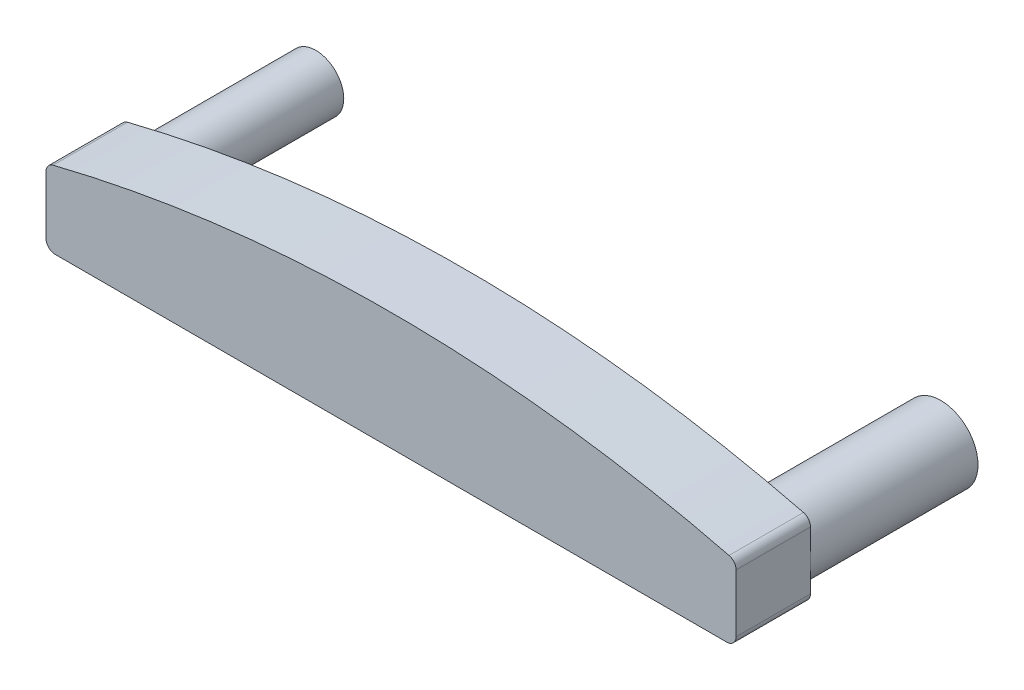
ISO-10303-21;
HEADER;
FILE_DESCRIPTION(('STEP AP214'),'2;1');
FILE_NAME('part.step','',(''),(''),'','','');
FILE_SCHEMA(('AUTOMOTIVE_DESIGN { 1 0 10303 214 1 1 1 1 }'));
ENDSEC;
DATA;
#1=APPLICATION_CONTEXT('core data for automotive mechanical design processes');
#2=APPLICATION_PROTOCOL_DEFINITION('international standard','automotive_design',2000,#1);
#3=PRODUCT_CONTEXT('',#1,'mechanical');
#4=PRODUCT('Part','Part','',(#3));
#5=PRODUCT_RELATED_PRODUCT_CATEGORY('part','',(#4));
#6=PRODUCT_DEFINITION_FORMATION('','',#4);
#7=PRODUCT_DEFINITION_CONTEXT('part definition',#1,'design');
#8=PRODUCT_DEFINITION('design','',#6,#7);
#9=PRODUCT_DEFINITION_SHAPE('','',#8);
#10=(LENGTH_UNIT() NAMED_UNIT(*) SI_UNIT(.MILLI.,.METRE.));
#11=(NAMED_UNIT(*) PLANE_ANGLE_UNIT() SI_UNIT($,.RADIAN.));
#12=(NAMED_UNIT(*) SI_UNIT($,.STERADIAN.) SOLID_ANGLE_UNIT());
#13=UNCERTAINTY_MEASURE_WITH_UNIT(LENGTH_MEASURE(1.E-05),#10,'distance_accuracy_value','');
#14=(GEOMETRIC_REPRESENTATION_CONTEXT(3) GLOBAL_UNCERTAINTY_ASSIGNED_CONTEXT((#13)) GLOBAL_UNIT_ASSIGNED_CONTEXT((#10,
#11,#12)) REPRESENTATION_CONTEXT('',''));
#15=CARTESIAN_POINT('',(0.,0.,0.));
#16=DIRECTION('',(0.,0.,1.));
#17=DIRECTION('',(1.,0.,0.));
#18=AXIS2_PLACEMENT_3D('',#15,#16,#17);
#19=CARTESIAN_POINT('',(18.54,-72.6723358644815,0.));
#20=DIRECTION('',(0.,0.,1.));
#21=DIRECTION('',(1.,0.,0.));
#22=AXIS2_PLACEMENT_3D('',#19,#20,#21);
#23=PLANE('',#22);
#24=DIRECTION('',(1.,0.,0.));
#25=VECTOR('',#24,1.);
#26=CARTESIAN_POINT('',(0.,-4.,0.));
#27=LINE('',#26,#25);
#28=CARTESIAN_POINT('',(0.5,-4.,0.));
#29=VERTEX_POINT('',#28);
#30=CARTESIAN_POINT('',(35.08,-4.,0.));
#31=VERTEX_POINT('',#30);
#32=EDGE_CURVE('E125',#29,#31,#27,.T.);
#33=ORIENTED_EDGE('',*,*,#32,.F.);
#34=CARTESIAN_POINT('',(0.5,-3.5,0.));
#35=DIRECTION('',(0.,0.,1.));
#36=DIRECTION('',(1.,0.,0.));
#37=AXIS2_PLACEMENT_3D('',#34,#35,#36);
#38=CIRCLE('',#37,0.5);
#39=CARTESIAN_POINT('',(0.,-3.5,0.));
#40=VERTEX_POINT('',#39);
#41=EDGE_CURVE('E168',#29,#40,#38,.F.);
#42=ORIENTED_EDGE('',*,*,#41,.T.);
#43=DIRECTION('',(0.,-1.,0.));
#44=VECTOR('',#43,1.);
#45=CARTESIAN_POINT('',(0.,0.,0.));
#46=LINE('',#45,#44);
#47=CARTESIAN_POINT('',(0.,-2.,0.));
#48=VERTEX_POINT('',#47);
#49=EDGE_CURVE('E156',#48,#40,#46,.T.);
#50=ORIENTED_EDGE('',*,*,#49,.F.);
#51=CARTESIAN_POINT('',(1.5,-2.,0.));
#52=DIRECTION('',(0.,0.,1.));
#53=DIRECTION('',(1.,0.,0.));
#54=AXIS2_PLACEMENT_3D('',#51,#52,#53);
#55=CIRCLE('',#54,1.5);
#56=EDGE_CURVE('E151',#48,#48,#55,.T.);
#57=ORIENTED_EDGE('',*,*,#56,.T.);
#58=CARTESIAN_POINT('',(0.,-0.38949972753953,0.));
#59=VERTEX_POINT('',#58);
#60=EDGE_CURVE('E155',#59,#48,#46,.T.);
#61=ORIENTED_EDGE('',*,*,#60,.F.);
#62=CARTESIAN_POINT('',(0.5,-0.38949972753953,0.));
#63=DIRECTION('',(0.,0.,1.));
#64=DIRECTION('',(1.,0.,0.));
#65=AXIS2_PLACEMENT_3D('',#62,#63,#64);
#66=CIRCLE('',#65,0.5);
#67=CARTESIAN_POINT('',(0.378926174496644,0.0956199780775407,0.));
#68=VERTEX_POINT('',#67);
#69=EDGE_CURVE('E164',#59,#68,#66,.F.);
#70=ORIENTED_EDGE('',*,*,#69,.T.);
#71=CARTESIAN_POINT('',(18.54,-72.6723358644815,0.));
#72=DIRECTION('',(0.,0.,1.));
#73=DIRECTION('',(1.,0.,0.));
#74=AXIS2_PLACEMENT_3D('',#71,#72,#73);
#75=CIRCLE('',#74,75.);
#76=CARTESIAN_POINT('',(36.7010738255034,0.0956199780775407,0.));
#77=VERTEX_POINT('',#76);
#78=EDGE_CURVE('E194',#77,#68,#75,.T.);
#79=ORIENTED_EDGE('',*,*,#78,.F.);
#80=CARTESIAN_POINT('',(36.58,-0.38949972753953,0.));
#81=DIRECTION('',(0.,0.,1.));
#82=DIRECTION('',(1.,0.,0.));
#83=AXIS2_PLACEMENT_3D('',#80,#81,#82);
#84=CIRCLE('',#83,0.5);
#85=CARTESIAN_POINT('',(37.08,-0.38949972753953,0.));
#86=VERTEX_POINT('',#85);
#87=EDGE_CURVE('E166',#77,#86,#84,.F.);
#88=ORIENTED_EDGE('',*,*,#87,.T.);
#89=DIRECTION('',(0.,-1.,0.));
#90=VECTOR('',#89,1.);
#91=CARTESIAN_POINT('',(37.08,0.,0.));
#92=LINE('',#91,#90);
#93=CARTESIAN_POINT('',(37.08,-2.,0.));
#94=VERTEX_POINT('',#93);
#95=EDGE_CURVE('E150',#86,#94,#92,.T.);
#96=ORIENTED_EDGE('',*,*,#95,.T.);
#97=CARTESIAN_POINT('',(35.08,-2.,0.));
#98=DIRECTION('',(0.,0.,1.));
#99=DIRECTION('',(1.,0.,0.));
#100=AXIS2_PLACEMENT_3D('',#97,#98,#99);
#101=CIRCLE('',#100,2.);
#102=EDGE_CURVE('E142',#94,#31,#101,.T.);
#103=ORIENTED_EDGE('',*,*,#102,.T.);
#104=EDGE_LOOP('',(#33,#42,#50,#57,#61,#70,#79,#88,#96,#103));
#105=FACE_BOUND('',#104,.T.);
#106=ADVANCED_FACE('F47',(#105),#23,.F.);
#107=CARTESIAN_POINT('',(18.54,-72.6723358644815,4.));
#108=DIRECTION('',(0.,0.,-1.));
#109=DIRECTION('',(-1.,0.,0.));
#110=AXIS2_PLACEMENT_3D('',#107,#108,#109);
#111=CYLINDRICAL_SURFACE('',#110,75.);
#112=CARTESIAN_POINT('',(18.54,-72.6723358644815,4.));
#113=DIRECTION('',(0.,0.,1.));
#114=DIRECTION('',(1.,0.,0.));
#115=AXIS2_PLACEMENT_3D('',#112,#113,#114);
#116=CIRCLE('',#115,75.);
#117=CARTESIAN_POINT('',(36.7010738255034,0.0956199780775407,4.));
#118=VERTEX_POINT('',#117);
#119=CARTESIAN_POINT('',(0.378926174496644,0.0956199780775407,4.));
#120=VERTEX_POINT('',#119);
#121=EDGE_CURVE('E160',#118,#120,#116,.T.);
#122=ORIENTED_EDGE('',*,*,#121,.F.);
#123=DIRECTION('',(0.,0.,-1.));
#124=VECTOR('',#123,1.);
#125=CARTESIAN_POINT('',(36.7010738255034,0.0956199780775407,4.));
#126=LINE('',#125,#124);
#127=EDGE_CURVE('E12',#118,#77,#126,.T.);
#128=ORIENTED_EDGE('',*,*,#127,.T.);
#129=ORIENTED_EDGE('',*,*,#78,.T.);
#130=DIRECTION('',(0.,0.,-1.));
#131=VECTOR('',#130,1.);
#132=CARTESIAN_POINT('',(0.378926174496648,0.0956199780775407,4.));
#133=LINE('',#132,#131);
#134=EDGE_CURVE('E55',#68,#120,#133,.F.);
#135=ORIENTED_EDGE('',*,*,#134,.T.);
#136=EDGE_LOOP('',(#122,#128,#129,#135));
#137=FACE_BOUND('',#136,.T.);
#138=ADVANCED_FACE('F191',(#137),#111,.T.);
#139=CARTESIAN_POINT('',(0.,0.,4.));
#140=DIRECTION('',(1.,0.,0.));
#141=DIRECTION('',(0.,0.,-1.));
#142=AXIS2_PLACEMENT_3D('',#139,#140,#141);
#143=PLANE('',#142);
#144=ORIENTED_EDGE('',*,*,#49,.T.);
#145=DIRECTION('',(0.,0.,-1.));
#146=VECTOR('',#145,1.);
#147=CARTESIAN_POINT('',(0.,-3.5,4.));
#148=LINE('',#147,#146);
#149=CARTESIAN_POINT('',(0.,-3.5,4.));
#150=VERTEX_POINT('',#149);
#151=EDGE_CURVE('E173',#40,#150,#148,.F.);
#152=ORIENTED_EDGE('',*,*,#151,.T.);
#153=DIRECTION('',(0.,-1.,0.));
#154=VECTOR('',#153,1.);
#155=CARTESIAN_POINT('',(0.,0.,4.));
#156=LINE('',#155,#154);
#157=CARTESIAN_POINT('',(0.,-0.38949972753953,4.));
#158=VERTEX_POINT('',#157);
#159=EDGE_CURVE('E201',#158,#150,#156,.T.);
#160=ORIENTED_EDGE('',*,*,#159,.F.);
#161=DIRECTION('',(0.,0.,-1.));
#162=VECTOR('',#161,1.);
#163=CARTESIAN_POINT('',(0.,-0.38949972753953,4.));
#164=LINE('',#163,#162);
#165=EDGE_CURVE('E170',#158,#59,#164,.T.);
#166=ORIENTED_EDGE('',*,*,#165,.T.);
#167=ORIENTED_EDGE('',*,*,#60,.T.);
#168=EDGE_LOOP('',(#144,#152,#160,#166,#167));
#169=FACE_BOUND('',#168,.T.);
#170=ADVANCED_FACE('F207',(#169),#143,.F.);
#171=CARTESIAN_POINT('',(0.,-4.,4.));
#172=DIRECTION('',(0.,1.,0.));
#173=DIRECTION('',(0.,0.,1.));
#174=AXIS2_PLACEMENT_3D('',#171,#172,#173);
#175=PLANE('',#174);
#176=DIRECTION('',(1.,0.,0.));
#177=VECTOR('',#176,1.);
#178=CARTESIAN_POINT('',(0.,-4.,4.));
#179=LINE('',#178,#177);
#180=CARTESIAN_POINT('',(0.5,-4.,4.));
#181=VERTEX_POINT('',#180);
#182=CARTESIAN_POINT('',(36.58,-4.,4.));
#183=VERTEX_POINT('',#182);
#184=EDGE_CURVE('E219',#181,#183,#179,.T.);
#185=ORIENTED_EDGE('',*,*,#184,.F.);
#186=DIRECTION('',(0.,0.,-1.));
#187=VECTOR('',#186,1.);
#188=CARTESIAN_POINT('',(0.5,-4.,4.));
#189=LINE('',#188,#187);
#190=EDGE_CURVE('E132',#181,#29,#189,.T.);
#191=ORIENTED_EDGE('',*,*,#190,.T.);
#192=ORIENTED_EDGE('',*,*,#32,.T.);
#193=CARTESIAN_POINT('',(36.58,-4.,0.));
#194=VERTEX_POINT('',#193);
#195=EDGE_CURVE('E130',#31,#194,#27,.T.);
#196=ORIENTED_EDGE('',*,*,#195,.T.);
#197=DIRECTION('',(0.,0.,-1.));
#198=VECTOR('',#197,1.);
#199=CARTESIAN_POINT('',(36.58,-4.,4.));
#200=LINE('',#199,#198);
#201=EDGE_CURVE('E146',#194,#183,#200,.F.);
#202=ORIENTED_EDGE('',*,*,#201,.T.);
#203=EDGE_LOOP('',(#185,#191,#192,#196,#202));
#204=FACE_BOUND('',#203,.T.);
#205=ADVANCED_FACE('F128',(#204),#175,.F.);
#206=CARTESIAN_POINT('',(37.08,0.,4.));
#207=DIRECTION('',(1.,0.,0.));
#208=DIRECTION('',(0.,0.,-1.));
#209=AXIS2_PLACEMENT_3D('',#206,#207,#208);
#210=PLANE('',#209);
#211=DIRECTION('',(0.,-1.,0.));
#212=VECTOR('',#211,1.);
#213=CARTESIAN_POINT('',(37.08,0.,4.));
#214=LINE('',#213,#212);
#215=CARTESIAN_POINT('',(37.08,-0.38949972753953,4.));
#216=VERTEX_POINT('',#215);
#217=CARTESIAN_POINT('',(37.08,-3.5,4.));
#218=VERTEX_POINT('',#217);
#219=EDGE_CURVE('E147',#216,#218,#214,.T.);
#220=ORIENTED_EDGE('',*,*,#219,.T.);
#221=DIRECTION('',(0.,0.,-1.));
#222=VECTOR('',#221,1.);
#223=CARTESIAN_POINT('',(37.08,-3.5,0.));
#224=LINE('',#223,#222);
#225=CARTESIAN_POINT('',(37.08,-3.5,0.));
#226=VERTEX_POINT('',#225);
#227=EDGE_CURVE('E184',#218,#226,#224,.T.);
#228=ORIENTED_EDGE('',*,*,#227,.T.);
#229=EDGE_CURVE('E135',#94,#226,#92,.T.);
#230=ORIENTED_EDGE('',*,*,#229,.F.);
#231=ORIENTED_EDGE('',*,*,#95,.F.);
#232=DIRECTION('',(0.,0.,1.));
#233=VECTOR('',#232,1.);
#234=CARTESIAN_POINT('',(37.08,-0.38949972753953,4.));
#235=LINE('',#234,#233);
#236=EDGE_CURVE('E182',#86,#216,#235,.T.);
#237=ORIENTED_EDGE('',*,*,#236,.T.);
#238=EDGE_LOOP('',(#220,#228,#230,#231,#237));
#239=FACE_BOUND('',#238,.T.);
#240=ADVANCED_FACE('F227',(#239),#210,.T.);
#241=CARTESIAN_POINT('',(18.54,-72.6723358644815,4.));
#242=DIRECTION('',(0.,0.,1.));
#243=DIRECTION('',(1.,0.,0.));
#244=AXIS2_PLACEMENT_3D('',#241,#242,#243);
#245=PLANE('',#244);
#246=ORIENTED_EDGE('',*,*,#159,.T.);
#247=CARTESIAN_POINT('',(0.5,-3.5,4.));
#248=DIRECTION('',(0.,0.,1.));
#249=DIRECTION('',(1.,0.,0.));
#250=AXIS2_PLACEMENT_3D('',#247,#248,#249);
#251=CIRCLE('',#250,0.5);
#252=EDGE_CURVE('E180',#150,#181,#251,.T.);
#253=ORIENTED_EDGE('',*,*,#252,.T.);
#254=ORIENTED_EDGE('',*,*,#184,.T.);
#255=CARTESIAN_POINT('',(36.58,-3.5,4.));
#256=DIRECTION('',(0.,0.,1.));
#257=DIRECTION('',(1.,0.,0.));
#258=AXIS2_PLACEMENT_3D('',#255,#256,#257);
#259=CIRCLE('',#258,0.5);
#260=EDGE_CURVE('E70',#183,#218,#259,.T.);
#261=ORIENTED_EDGE('',*,*,#260,.T.);
#262=ORIENTED_EDGE('',*,*,#219,.F.);
#263=CARTESIAN_POINT('',(36.58,-0.38949972753953,4.));
#264=DIRECTION('',(0.,0.,1.));
#265=DIRECTION('',(1.,0.,0.));
#266=AXIS2_PLACEMENT_3D('',#263,#264,#265);
#267=CIRCLE('',#266,0.5);
#268=EDGE_CURVE('E177',#216,#118,#267,.T.);
#269=ORIENTED_EDGE('',*,*,#268,.T.);
#270=ORIENTED_EDGE('',*,*,#121,.T.);
#271=CARTESIAN_POINT('',(0.5,-0.38949972753953,4.));
#272=DIRECTION('',(0.,0.,1.));
#273=DIRECTION('',(1.,0.,0.));
#274=AXIS2_PLACEMENT_3D('',#271,#272,#273);
#275=CIRCLE('',#274,0.5);
#276=EDGE_CURVE('E175',#120,#158,#275,.T.);
#277=ORIENTED_EDGE('',*,*,#276,.T.);
#278=EDGE_LOOP('',(#246,#253,#254,#261,#262,#269,#270,#277));
#279=FACE_BOUND('',#278,.T.);
#280=ADVANCED_FACE('F198',(#279),#245,.T.);
#281=ORIENTED_EDGE('',*,*,#229,.T.);
#282=CARTESIAN_POINT('',(36.58,-3.5,0.));
#283=DIRECTION('',(0.,0.,1.));
#284=DIRECTION('',(1.,0.,0.));
#285=AXIS2_PLACEMENT_3D('',#282,#283,#284);
#286=CIRCLE('',#285,0.5);
#287=EDGE_CURVE('E62',#226,#194,#286,.F.);
#288=ORIENTED_EDGE('',*,*,#287,.T.);
#289=ORIENTED_EDGE('',*,*,#195,.F.);
#290=CARTESIAN_POINT('',(35.08,-2.,0.));
#291=DIRECTION('',(0.,0.,1.));
#292=DIRECTION('',(1.,0.,0.));
#293=AXIS2_PLACEMENT_3D('',#290,#291,#292);
#294=CIRCLE('',#293,2.);
#295=EDGE_CURVE('E140',#31,#94,#294,.T.);
#296=ORIENTED_EDGE('',*,*,#295,.T.);
#297=EDGE_LOOP('',(#281,#288,#289,#296));
#298=FACE_BOUND('',#297,.T.);
#299=ADVANCED_FACE('F154',(#298),#23,.F.);
#300=CARTESIAN_POINT('',(1.5,-2.,-9.));
#301=DIRECTION('',(0.,0.,1.));
#302=DIRECTION('',(1.,0.,0.));
#303=AXIS2_PLACEMENT_3D('',#300,#301,#302);
#304=CYLINDRICAL_SURFACE('',#303,1.5);
#305=CARTESIAN_POINT('',(1.5,-2.,-9.));
#306=DIRECTION('',(0.,0.,1.));
#307=DIRECTION('',(1.,0.,0.));
#308=AXIS2_PLACEMENT_3D('',#305,#306,#307);
#309=CIRCLE('',#308,1.5);
#310=CARTESIAN_POINT('',(3.,-2.,-9.));
#311=VERTEX_POINT('',#310);
#312=EDGE_CURVE('E212',#311,#311,#309,.T.);
#313=ORIENTED_EDGE('',*,*,#312,.T.);
#314=EDGE_LOOP('',(#313));
#315=FACE_BOUND('',#314,.T.);
#316=ORIENTED_EDGE('',*,*,#56,.F.);
#317=EDGE_LOOP('',(#316));
#318=FACE_BOUND('',#317,.T.);
#319=ADVANCED_FACE('F246',(#315,#318),#304,.T.);
#320=CARTESIAN_POINT('',(0.,0.,-9.));
#321=DIRECTION('',(0.,0.,1.));
#322=DIRECTION('',(1.,0.,0.));
#323=AXIS2_PLACEMENT_3D('',#320,#321,#322);
#324=PLANE('',#323);
#325=ORIENTED_EDGE('',*,*,#312,.F.);
#326=EDGE_LOOP('',(#325));
#327=FACE_BOUND('',#326,.T.);
#328=ADVANCED_FACE('F251',(#327),#324,.F.);
#329=CARTESIAN_POINT('',(35.08,-2.,-9.));
#330=DIRECTION('',(0.,0.,1.));
#331=DIRECTION('',(1.,0.,0.));
#332=AXIS2_PLACEMENT_3D('',#329,#330,#331);
#333=CYLINDRICAL_SURFACE('',#332,2.);
#334=CARTESIAN_POINT('',(35.08,-2.,-9.));
#335=DIRECTION('',(0.,0.,1.));
#336=DIRECTION('',(1.,0.,0.));
#337=AXIS2_PLACEMENT_3D('',#334,#335,#336);
#338=CIRCLE('',#337,2.);
#339=CARTESIAN_POINT('',(37.08,-2.,-9.));
#340=VERTEX_POINT('',#339);
#341=EDGE_CURVE('E152',#340,#340,#338,.T.);
#342=ORIENTED_EDGE('',*,*,#341,.T.);
#343=EDGE_LOOP('',(#342));
#344=FACE_BOUND('',#343,.T.);
#345=ORIENTED_EDGE('',*,*,#102,.F.);
#346=ORIENTED_EDGE('',*,*,#295,.F.);
#347=EDGE_LOOP('',(#345,#346));
#348=FACE_BOUND('',#347,.T.);
#349=ADVANCED_FACE('F141',(#344,#348),#333,.T.);
#350=CARTESIAN_POINT('',(0.,0.,-9.));
#351=DIRECTION('',(0.,0.,1.));
#352=DIRECTION('',(1.,0.,0.));
#353=AXIS2_PLACEMENT_3D('',#350,#351,#352);
#354=PLANE('',#353);
#355=ORIENTED_EDGE('',*,*,#341,.F.);
#356=EDGE_LOOP('',(#355));
#357=FACE_BOUND('',#356,.T.);
#358=ADVANCED_FACE('F261',(#357),#354,.F.);
#359=CARTESIAN_POINT('',(0.5,-3.5,4.));
#360=DIRECTION('',(0.,0.,-1.));
#361=DIRECTION('',(-1.,0.,0.));
#362=AXIS2_PLACEMENT_3D('',#359,#360,#361);
#363=CYLINDRICAL_SURFACE('',#362,0.5);
#364=ORIENTED_EDGE('',*,*,#252,.F.);
#365=ORIENTED_EDGE('',*,*,#151,.F.);
#366=ORIENTED_EDGE('',*,*,#41,.F.);
#367=ORIENTED_EDGE('',*,*,#190,.F.);
#368=EDGE_LOOP('',(#364,#365,#366,#367));
#369=FACE_BOUND('',#368,.T.);
#370=ADVANCED_FACE('F224',(#369),#363,.T.);
#371=CARTESIAN_POINT('',(36.58,-3.5,4.));
#372=DIRECTION('',(0.,0.,1.));
#373=DIRECTION('',(1.,0.,0.));
#374=AXIS2_PLACEMENT_3D('',#371,#372,#373);
#375=CYLINDRICAL_SURFACE('',#374,0.5);
#376=ORIENTED_EDGE('',*,*,#260,.F.);
#377=ORIENTED_EDGE('',*,*,#201,.F.);
#378=ORIENTED_EDGE('',*,*,#287,.F.);
#379=ORIENTED_EDGE('',*,*,#227,.F.);
#380=EDGE_LOOP('',(#376,#377,#378,#379));
#381=FACE_BOUND('',#380,.T.);
#382=ADVANCED_FACE('F225',(#381),#375,.T.);
#383=CARTESIAN_POINT('',(36.58,-0.38949972753953,4.));
#384=DIRECTION('',(0.,0.,-1.));
#385=DIRECTION('',(-1.,0.,0.));
#386=AXIS2_PLACEMENT_3D('',#383,#384,#385);
#387=CYLINDRICAL_SURFACE('',#386,0.5);
#388=ORIENTED_EDGE('',*,*,#268,.F.);
#389=ORIENTED_EDGE('',*,*,#236,.F.);
#390=ORIENTED_EDGE('',*,*,#87,.F.);
#391=ORIENTED_EDGE('',*,*,#127,.F.);
#392=EDGE_LOOP('',(#388,#389,#390,#391));
#393=FACE_BOUND('',#392,.T.);
#394=ADVANCED_FACE('F230',(#393),#387,.T.);
#395=CARTESIAN_POINT('',(0.5,-0.38949972753953,4.));
#396=DIRECTION('',(0.,0.,-1.));
#397=DIRECTION('',(-1.,0.,0.));
#398=AXIS2_PLACEMENT_3D('',#395,#396,#397);
#399=CYLINDRICAL_SURFACE('',#398,0.5);
#400=ORIENTED_EDGE('',*,*,#276,.F.);
#401=ORIENTED_EDGE('',*,*,#134,.F.);
#402=ORIENTED_EDGE('',*,*,#69,.F.);
#403=ORIENTED_EDGE('',*,*,#165,.F.);
#404=EDGE_LOOP('',(#400,#401,#402,#403));
#405=FACE_BOUND('',#404,.T.);
#406=ADVANCED_FACE('F49',(#405),#399,.T.);
#407=CLOSED_SHELL('',(#106,#138,#170,#205,#240,#280,#299,#319,#328,#349,#358,#370,#382,#394,#406));
#408=MANIFOLD_SOLID_BREP('B2',#407);
#409=ADVANCED_BREP_SHAPE_REPRESENTATION('',(#18,#408),#14);
#410=SHAPE_DEFINITION_REPRESENTATION(#9,#409);
ENDSEC;
END-ISO-10303-21;
